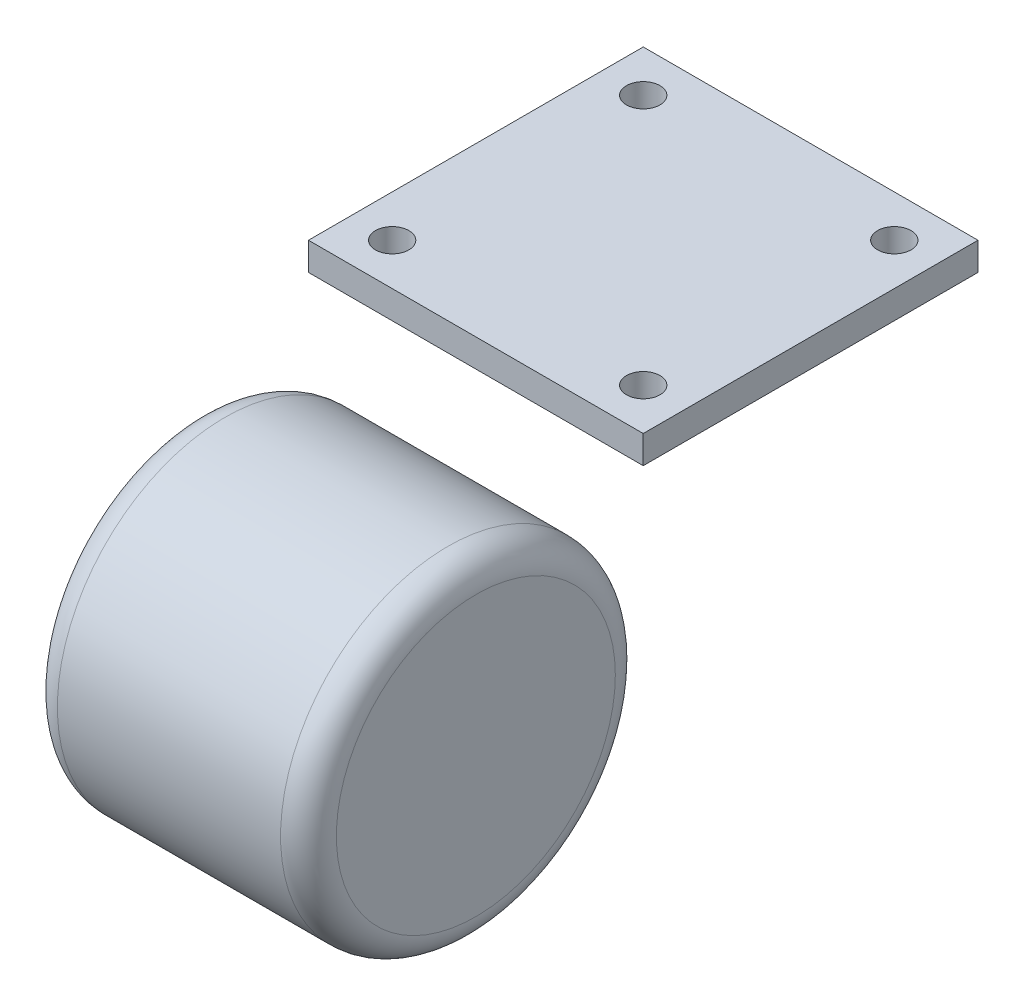
ISO-10303-21;
HEADER;
FILE_DESCRIPTION(('STEP AP214'),'2;1');
FILE_NAME('part.step','',(''),(''),'','','');
FILE_SCHEMA(('AUTOMOTIVE_DESIGN { 1 0 10303 214 1 1 1 1 }'));
ENDSEC;
DATA;
#1=APPLICATION_CONTEXT('core data for automotive mechanical design processes');
#2=APPLICATION_PROTOCOL_DEFINITION('international standard','automotive_design',2000,#1);
#3=PRODUCT_CONTEXT('',#1,'mechanical');
#4=PRODUCT('Part','Part','',(#3));
#5=PRODUCT_RELATED_PRODUCT_CATEGORY('part','',(#4));
#6=PRODUCT_DEFINITION_FORMATION('','',#4);
#7=PRODUCT_DEFINITION_CONTEXT('part definition',#1,'design');
#8=PRODUCT_DEFINITION('design','',#6,#7);
#9=PRODUCT_DEFINITION_SHAPE('','',#8);
#10=(LENGTH_UNIT() NAMED_UNIT(*) SI_UNIT(.MILLI.,.METRE.));
#11=(NAMED_UNIT(*) PLANE_ANGLE_UNIT() SI_UNIT($,.RADIAN.));
#12=(NAMED_UNIT(*) SI_UNIT($,.STERADIAN.) SOLID_ANGLE_UNIT());
#13=UNCERTAINTY_MEASURE_WITH_UNIT(LENGTH_MEASURE(1.E-05),#10,'distance_accuracy_value','');
#14=(GEOMETRIC_REPRESENTATION_CONTEXT(3) GLOBAL_UNCERTAINTY_ASSIGNED_CONTEXT((#13)) GLOBAL_UNIT_ASSIGNED_CONTEXT((#10,
#11,#12)) REPRESENTATION_CONTEXT('',''));
#15=CARTESIAN_POINT('',(0.,0.,0.));
#16=DIRECTION('',(0.,0.,1.));
#17=DIRECTION('',(1.,0.,0.));
#18=AXIS2_PLACEMENT_3D('',#15,#16,#17);
#19=CARTESIAN_POINT('',(25.,-35.,55.));
#20=DIRECTION('',(-1.,0.,0.));
#21=DIRECTION('',(0.,0.,1.));
#22=AXIS2_PLACEMENT_3D('',#19,#20,#21);
#23=CYLINDRICAL_SURFACE('',#22,30.);
#24=CARTESIAN_POINT('',(-20.,-35.,55.));
#25=DIRECTION('',(1.,0.,0.));
#26=DIRECTION('',(0.,0.,-1.));
#27=AXIS2_PLACEMENT_3D('',#24,#25,#26);
#28=CIRCLE('',#27,30.);
#29=CARTESIAN_POINT('',(-20.,-35.,25.));
#30=VERTEX_POINT('',#29);
#31=EDGE_CURVE('E51',#30,#30,#28,.T.);
#32=ORIENTED_EDGE('',*,*,#31,.T.);
#33=EDGE_LOOP('',(#32));
#34=FACE_BOUND('',#33,.T.);
#35=CARTESIAN_POINT('',(20.,-35.,55.));
#36=DIRECTION('',(1.,0.,0.));
#37=DIRECTION('',(0.,0.,-1.));
#38=AXIS2_PLACEMENT_3D('',#35,#36,#37);
#39=CIRCLE('',#38,30.);
#40=CARTESIAN_POINT('',(20.,-35.,25.));
#41=VERTEX_POINT('',#40);
#42=EDGE_CURVE('E55',#41,#41,#39,.F.);
#43=ORIENTED_EDGE('',*,*,#42,.T.);
#44=EDGE_LOOP('',(#43));
#45=FACE_BOUND('',#44,.T.);
#46=ADVANCED_FACE('F40',(#34,#45),#23,.T.);
#47=CARTESIAN_POINT('',(25.,-35.,55.));
#48=DIRECTION('',(1.,0.,0.));
#49=DIRECTION('',(0.,0.,-1.));
#50=AXIS2_PLACEMENT_3D('',#47,#48,#49);
#51=PLANE('',#50);
#52=CARTESIAN_POINT('',(25.,-35.,55.));
#53=DIRECTION('',(1.,0.,0.));
#54=DIRECTION('',(0.,0.,-1.));
#55=AXIS2_PLACEMENT_3D('',#52,#53,#54);
#56=CIRCLE('',#55,25.);
#57=CARTESIAN_POINT('',(25.,-35.,30.));
#58=VERTEX_POINT('',#57);
#59=EDGE_CURVE('E11',#58,#58,#56,.T.);
#60=ORIENTED_EDGE('',*,*,#59,.T.);
#61=EDGE_LOOP('',(#60));
#62=FACE_BOUND('',#61,.T.);
#63=ADVANCED_FACE('F71',(#62),#51,.T.);
#64=CARTESIAN_POINT('',(-25.,-35.,55.));
#65=DIRECTION('',(1.,0.,0.));
#66=DIRECTION('',(0.,0.,-1.));
#67=AXIS2_PLACEMENT_3D('',#64,#65,#66);
#68=PLANE('',#67);
#69=CARTESIAN_POINT('',(-25.,-35.,55.));
#70=DIRECTION('',(1.,0.,0.));
#71=DIRECTION('',(0.,0.,-1.));
#72=AXIS2_PLACEMENT_3D('',#69,#70,#71);
#73=CIRCLE('',#72,25.);
#74=CARTESIAN_POINT('',(-25.,-35.,30.));
#75=VERTEX_POINT('',#74);
#76=EDGE_CURVE('E47',#75,#75,#73,.F.);
#77=ORIENTED_EDGE('',*,*,#76,.T.);
#78=EDGE_LOOP('',(#77));
#79=FACE_BOUND('',#78,.T.);
#80=ADVANCED_FACE('F68',(#79),#68,.F.);
#81=CARTESIAN_POINT('',(-20.,-35.,55.));
#82=DIRECTION('',(1.,0.,0.));
#83=DIRECTION('',(0.,0.,-1.));
#84=AXIS2_PLACEMENT_3D('',#81,#82,#83);
#85=TOROIDAL_SURFACE('',#84,25.,5.);
#86=ORIENTED_EDGE('',*,*,#76,.F.);
#87=EDGE_LOOP('',(#86));
#88=FACE_BOUND('',#87,.T.);
#89=ORIENTED_EDGE('',*,*,#31,.F.);
#90=EDGE_LOOP('',(#89));
#91=FACE_BOUND('',#90,.T.);
#92=ADVANCED_FACE('F64',(#88,#91),#85,.T.);
#93=CARTESIAN_POINT('',(20.,-35.,55.));
#94=DIRECTION('',(1.,0.,0.));
#95=DIRECTION('',(0.,0.,-1.));
#96=AXIS2_PLACEMENT_3D('',#93,#94,#95);
#97=TOROIDAL_SURFACE('',#96,25.,5.);
#98=ORIENTED_EDGE('',*,*,#42,.F.);
#99=EDGE_LOOP('',(#98));
#100=FACE_BOUND('',#99,.T.);
#101=ORIENTED_EDGE('',*,*,#59,.F.);
#102=EDGE_LOOP('',(#101));
#103=FACE_BOUND('',#102,.T.);
#104=ADVANCED_FACE('F42',(#100,#103),#97,.T.);
#105=CLOSED_SHELL('',(#46,#63,#80,#92,#104));
#106=MANIFOLD_SOLID_BREP('B2',#105);
#107=CARTESIAN_POINT('',(0.,5.,0.));
#108=DIRECTION('',(0.,-1.,0.));
#109=DIRECTION('',(0.,0.,-1.));
#110=AXIS2_PLACEMENT_3D('',#107,#108,#109);
#111=PLANE('',#110);
#112=DIRECTION('',(0.,0.,-1.));
#113=VECTOR('',#112,1.);
#114=CARTESIAN_POINT('',(30.,5.,30.));
#115=LINE('',#114,#113);
#116=CARTESIAN_POINT('',(30.,5.,30.));
#117=VERTEX_POINT('',#116);
#118=CARTESIAN_POINT('',(30.,5.,-30.));
#119=VERTEX_POINT('',#118);
#120=EDGE_CURVE('E162',#117,#119,#115,.T.);
#121=ORIENTED_EDGE('',*,*,#120,.T.);
#122=DIRECTION('',(-1.,0.,0.));
#123=VECTOR('',#122,1.);
#124=CARTESIAN_POINT('',(-30.,5.,-30.));
#125=LINE('',#124,#123);
#126=CARTESIAN_POINT('',(-30.,5.,-30.));
#127=VERTEX_POINT('',#126);
#128=EDGE_CURVE('E157',#119,#127,#125,.T.);
#129=ORIENTED_EDGE('',*,*,#128,.T.);
#130=DIRECTION('',(0.,0.,1.));
#131=VECTOR('',#130,1.);
#132=CARTESIAN_POINT('',(-30.,5.,30.));
#133=LINE('',#132,#131);
#134=CARTESIAN_POINT('',(-30.,5.,30.));
#135=VERTEX_POINT('',#134);
#136=EDGE_CURVE('E160',#127,#135,#133,.T.);
#137=ORIENTED_EDGE('',*,*,#136,.T.);
#138=DIRECTION('',(1.,0.,0.));
#139=VECTOR('',#138,1.);
#140=CARTESIAN_POINT('',(-30.,5.,30.));
#141=LINE('',#140,#139);
#142=EDGE_CURVE('E127',#135,#117,#141,.T.);
#143=ORIENTED_EDGE('',*,*,#142,.T.);
#144=EDGE_LOOP('',(#121,#129,#137,#143));
#145=FACE_BOUND('',#144,.T.);
#146=CARTESIAN_POINT('',(22.5,5.,-22.5));
#147=DIRECTION('',(0.,1.,0.));
#148=DIRECTION('',(0.,0.,1.));
#149=AXIS2_PLACEMENT_3D('',#146,#147,#148);
#150=CIRCLE('',#149,3.);
#151=CARTESIAN_POINT('',(22.5,5.,-19.5));
#152=VERTEX_POINT('',#151);
#153=EDGE_CURVE('E177',#152,#152,#150,.T.);
#154=ORIENTED_EDGE('',*,*,#153,.F.);
#155=EDGE_LOOP('',(#154));
#156=FACE_BOUND('',#155,.T.);
#157=CARTESIAN_POINT('',(-22.5,5.,-22.5));
#158=DIRECTION('',(0.,1.,0.));
#159=DIRECTION('',(0.,0.,-1.));
#160=AXIS2_PLACEMENT_3D('',#157,#158,#159);
#161=CIRCLE('',#160,3.);
#162=CARTESIAN_POINT('',(-22.5,5.,-25.5));
#163=VERTEX_POINT('',#162);
#164=EDGE_CURVE('E192',#163,#163,#161,.T.);
#165=ORIENTED_EDGE('',*,*,#164,.F.);
#166=EDGE_LOOP('',(#165));
#167=FACE_BOUND('',#166,.T.);
#168=CARTESIAN_POINT('',(22.5,5.,22.5));
#169=DIRECTION('',(0.,1.,0.));
#170=DIRECTION('',(0.,0.,-1.));
#171=AXIS2_PLACEMENT_3D('',#168,#169,#170);
#172=CIRCLE('',#171,3.);
#173=CARTESIAN_POINT('',(22.5,5.,19.5));
#174=VERTEX_POINT('',#173);
#175=EDGE_CURVE('E198',#174,#174,#172,.T.);
#176=ORIENTED_EDGE('',*,*,#175,.F.);
#177=EDGE_LOOP('',(#176));
#178=FACE_BOUND('',#177,.T.);
#179=CARTESIAN_POINT('',(-22.5,5.,22.5));
#180=DIRECTION('',(0.,1.,0.));
#181=DIRECTION('',(0.,0.,1.));
#182=AXIS2_PLACEMENT_3D('',#179,#180,#181);
#183=CIRCLE('',#182,3.);
#184=CARTESIAN_POINT('',(-22.5,5.,25.5));
#185=VERTEX_POINT('',#184);
#186=EDGE_CURVE('E204',#185,#185,#183,.T.);
#187=ORIENTED_EDGE('',*,*,#186,.F.);
#188=EDGE_LOOP('',(#187));
#189=FACE_BOUND('',#188,.T.);
#190=ADVANCED_FACE('F110',(#145,#156,#167,#178,#189),#111,.F.);
#191=CARTESIAN_POINT('',(0.,0.,0.));
#192=DIRECTION('',(0.,-1.,0.));
#193=DIRECTION('',(0.,0.,-1.));
#194=AXIS2_PLACEMENT_3D('',#191,#192,#193);
#195=PLANE('',#194);
#196=CARTESIAN_POINT('',(22.5,0.,22.5));
#197=DIRECTION('',(0.,1.,0.));
#198=DIRECTION('',(0.,0.,-1.));
#199=AXIS2_PLACEMENT_3D('',#196,#197,#198);
#200=CIRCLE('',#199,3.);
#201=CARTESIAN_POINT('',(22.5,0.,19.5));
#202=VERTEX_POINT('',#201);
#203=EDGE_CURVE('E201',#202,#202,#200,.T.);
#204=ORIENTED_EDGE('',*,*,#203,.T.);
#205=EDGE_LOOP('',(#204));
#206=FACE_BOUND('',#205,.T.);
#207=CARTESIAN_POINT('',(22.5,0.,-22.5));
#208=DIRECTION('',(0.,1.,0.));
#209=DIRECTION('',(0.,0.,1.));
#210=AXIS2_PLACEMENT_3D('',#207,#208,#209);
#211=CIRCLE('',#210,3.);
#212=CARTESIAN_POINT('',(22.5,0.,-19.5));
#213=VERTEX_POINT('',#212);
#214=EDGE_CURVE('E189',#213,#213,#211,.T.);
#215=ORIENTED_EDGE('',*,*,#214,.T.);
#216=EDGE_LOOP('',(#215));
#217=FACE_BOUND('',#216,.T.);
#218=DIRECTION('',(0.,0.,-1.));
#219=VECTOR('',#218,1.);
#220=CARTESIAN_POINT('',(30.,0.,30.));
#221=LINE('',#220,#219);
#222=CARTESIAN_POINT('',(30.,0.,30.));
#223=VERTEX_POINT('',#222);
#224=CARTESIAN_POINT('',(30.,0.,-30.));
#225=VERTEX_POINT('',#224);
#226=EDGE_CURVE('E174',#223,#225,#221,.T.);
#227=ORIENTED_EDGE('',*,*,#226,.F.);
#228=DIRECTION('',(1.,0.,0.));
#229=VECTOR('',#228,1.);
#230=CARTESIAN_POINT('',(-30.,0.,30.));
#231=LINE('',#230,#229);
#232=CARTESIAN_POINT('',(-30.,0.,30.));
#233=VERTEX_POINT('',#232);
#234=EDGE_CURVE('E150',#233,#223,#231,.T.);
#235=ORIENTED_EDGE('',*,*,#234,.F.);
#236=DIRECTION('',(0.,0.,1.));
#237=VECTOR('',#236,1.);
#238=CARTESIAN_POINT('',(-30.,0.,30.));
#239=LINE('',#238,#237);
#240=CARTESIAN_POINT('',(-30.,0.,-30.));
#241=VERTEX_POINT('',#240);
#242=EDGE_CURVE('E144',#241,#233,#239,.T.);
#243=ORIENTED_EDGE('',*,*,#242,.F.);
#244=DIRECTION('',(-1.,0.,0.));
#245=VECTOR('',#244,1.);
#246=CARTESIAN_POINT('',(-30.,0.,-30.));
#247=LINE('',#246,#245);
#248=EDGE_CURVE('E166',#225,#241,#247,.T.);
#249=ORIENTED_EDGE('',*,*,#248,.F.);
#250=EDGE_LOOP('',(#227,#235,#243,#249));
#251=FACE_BOUND('',#250,.T.);
#252=CARTESIAN_POINT('',(-22.5,0.,-22.5));
#253=DIRECTION('',(0.,1.,0.));
#254=DIRECTION('',(0.,0.,-1.));
#255=AXIS2_PLACEMENT_3D('',#252,#253,#254);
#256=CIRCLE('',#255,3.);
#257=CARTESIAN_POINT('',(-22.5,0.,-25.5));
#258=VERTEX_POINT('',#257);
#259=EDGE_CURVE('E195',#258,#258,#256,.T.);
#260=ORIENTED_EDGE('',*,*,#259,.T.);
#261=EDGE_LOOP('',(#260));
#262=FACE_BOUND('',#261,.T.);
#263=CARTESIAN_POINT('',(-22.5,0.,22.5));
#264=DIRECTION('',(0.,1.,0.));
#265=DIRECTION('',(0.,0.,1.));
#266=AXIS2_PLACEMENT_3D('',#263,#264,#265);
#267=CIRCLE('',#266,3.);
#268=CARTESIAN_POINT('',(-22.5,0.,25.5));
#269=VERTEX_POINT('',#268);
#270=EDGE_CURVE('E207',#269,#269,#267,.T.);
#271=ORIENTED_EDGE('',*,*,#270,.T.);
#272=EDGE_LOOP('',(#271));
#273=FACE_BOUND('',#272,.T.);
#274=ADVANCED_FACE('F185',(#206,#217,#251,#262,#273),#195,.T.);
#275=CARTESIAN_POINT('',(30.,5.,30.));
#276=DIRECTION('',(-1.,0.,0.));
#277=DIRECTION('',(0.,0.,1.));
#278=AXIS2_PLACEMENT_3D('',#275,#276,#277);
#279=PLANE('',#278);
#280=ORIENTED_EDGE('',*,*,#226,.T.);
#281=DIRECTION('',(0.,-1.,0.));
#282=VECTOR('',#281,1.);
#283=CARTESIAN_POINT('',(30.,5.,-30.));
#284=LINE('',#283,#282);
#285=EDGE_CURVE('E38',#119,#225,#284,.T.);
#286=ORIENTED_EDGE('',*,*,#285,.F.);
#287=ORIENTED_EDGE('',*,*,#120,.F.);
#288=DIRECTION('',(0.,-1.,0.));
#289=VECTOR('',#288,1.);
#290=CARTESIAN_POINT('',(30.,5.,30.));
#291=LINE('',#290,#289);
#292=EDGE_CURVE('E170',#117,#223,#291,.T.);
#293=ORIENTED_EDGE('',*,*,#292,.T.);
#294=EDGE_LOOP('',(#280,#286,#287,#293));
#295=FACE_BOUND('',#294,.T.);
#296=ADVANCED_FACE('F112',(#295),#279,.F.);
#297=CARTESIAN_POINT('',(-30.,5.,-30.));
#298=DIRECTION('',(0.,0.,1.));
#299=DIRECTION('',(1.,0.,0.));
#300=AXIS2_PLACEMENT_3D('',#297,#298,#299);
#301=PLANE('',#300);
#302=ORIENTED_EDGE('',*,*,#248,.T.);
#303=DIRECTION('',(0.,-1.,0.));
#304=VECTOR('',#303,1.);
#305=CARTESIAN_POINT('',(-30.,5.,-30.));
#306=LINE('',#305,#304);
#307=EDGE_CURVE('E119',#127,#241,#306,.T.);
#308=ORIENTED_EDGE('',*,*,#307,.F.);
#309=ORIENTED_EDGE('',*,*,#128,.F.);
#310=ORIENTED_EDGE('',*,*,#285,.T.);
#311=EDGE_LOOP('',(#302,#308,#309,#310));
#312=FACE_BOUND('',#311,.T.);
#313=ADVANCED_FACE('F165',(#312),#301,.F.);
#314=CARTESIAN_POINT('',(-30.,5.,30.));
#315=DIRECTION('',(1.,0.,0.));
#316=DIRECTION('',(0.,0.,-1.));
#317=AXIS2_PLACEMENT_3D('',#314,#315,#316);
#318=PLANE('',#317);
#319=ORIENTED_EDGE('',*,*,#242,.T.);
#320=DIRECTION('',(0.,-1.,0.));
#321=VECTOR('',#320,1.);
#322=CARTESIAN_POINT('',(-30.,5.,30.));
#323=LINE('',#322,#321);
#324=EDGE_CURVE('E167',#135,#233,#323,.T.);
#325=ORIENTED_EDGE('',*,*,#324,.F.);
#326=ORIENTED_EDGE('',*,*,#136,.F.);
#327=ORIENTED_EDGE('',*,*,#307,.T.);
#328=EDGE_LOOP('',(#319,#325,#326,#327));
#329=FACE_BOUND('',#328,.T.);
#330=ADVANCED_FACE('F168',(#329),#318,.F.);
#331=CARTESIAN_POINT('',(-30.,5.,30.));
#332=DIRECTION('',(0.,0.,-1.));
#333=DIRECTION('',(-1.,0.,0.));
#334=AXIS2_PLACEMENT_3D('',#331,#332,#333);
#335=PLANE('',#334);
#336=ORIENTED_EDGE('',*,*,#234,.T.);
#337=ORIENTED_EDGE('',*,*,#292,.F.);
#338=ORIENTED_EDGE('',*,*,#142,.F.);
#339=ORIENTED_EDGE('',*,*,#324,.T.);
#340=EDGE_LOOP('',(#336,#337,#338,#339));
#341=FACE_BOUND('',#340,.T.);
#342=ADVANCED_FACE('F182',(#341),#335,.F.);
#343=CARTESIAN_POINT('',(22.5,5.,-22.5));
#344=DIRECTION('',(0.,-1.,0.));
#345=DIRECTION('',(0.,0.,-1.));
#346=AXIS2_PLACEMENT_3D('',#343,#344,#345);
#347=CYLINDRICAL_SURFACE('',#346,3.);
#348=ORIENTED_EDGE('',*,*,#153,.T.);
#349=EDGE_LOOP('',(#348));
#350=FACE_BOUND('',#349,.T.);
#351=ORIENTED_EDGE('',*,*,#214,.F.);
#352=EDGE_LOOP('',(#351));
#353=FACE_BOUND('',#352,.T.);
#354=ADVANCED_FACE('F224',(#350,#353),#347,.F.);
#355=CARTESIAN_POINT('',(-22.5,5.,-22.5));
#356=DIRECTION('',(0.,-1.,0.));
#357=DIRECTION('',(0.,0.,-1.));
#358=AXIS2_PLACEMENT_3D('',#355,#356,#357);
#359=CYLINDRICAL_SURFACE('',#358,3.);
#360=ORIENTED_EDGE('',*,*,#164,.T.);
#361=EDGE_LOOP('',(#360));
#362=FACE_BOUND('',#361,.T.);
#363=ORIENTED_EDGE('',*,*,#259,.F.);
#364=EDGE_LOOP('',(#363));
#365=FACE_BOUND('',#364,.T.);
#366=ADVANCED_FACE('F270',(#362,#365),#359,.F.);
#367=CARTESIAN_POINT('',(22.5,5.,22.5));
#368=DIRECTION('',(0.,-1.,0.));
#369=DIRECTION('',(0.,0.,-1.));
#370=AXIS2_PLACEMENT_3D('',#367,#368,#369);
#371=CYLINDRICAL_SURFACE('',#370,3.);
#372=ORIENTED_EDGE('',*,*,#175,.T.);
#373=EDGE_LOOP('',(#372));
#374=FACE_BOUND('',#373,.T.);
#375=ORIENTED_EDGE('',*,*,#203,.F.);
#376=EDGE_LOOP('',(#375));
#377=FACE_BOUND('',#376,.T.);
#378=ADVANCED_FACE('F278',(#374,#377),#371,.F.);
#379=CARTESIAN_POINT('',(-22.5,5.,22.5));
#380=DIRECTION('',(0.,-1.,0.));
#381=DIRECTION('',(0.,0.,-1.));
#382=AXIS2_PLACEMENT_3D('',#379,#380,#381);
#383=CYLINDRICAL_SURFACE('',#382,3.);
#384=ORIENTED_EDGE('',*,*,#186,.T.);
#385=EDGE_LOOP('',(#384));
#386=FACE_BOUND('',#385,.T.);
#387=ORIENTED_EDGE('',*,*,#270,.F.);
#388=EDGE_LOOP('',(#387));
#389=FACE_BOUND('',#388,.T.);
#390=ADVANCED_FACE('F213',(#386,#389),#383,.F.);
#391=CLOSED_SHELL('',(#190,#274,#296,#313,#330,#342,#354,#366,#378,#390));
#392=MANIFOLD_SOLID_BREP('B6',#391);
#393=ADVANCED_BREP_SHAPE_REPRESENTATION('',(#18,#106,#392),#14);
#394=SHAPE_DEFINITION_REPRESENTATION(#9,#393);
ENDSEC;
END-ISO-10303-21;
